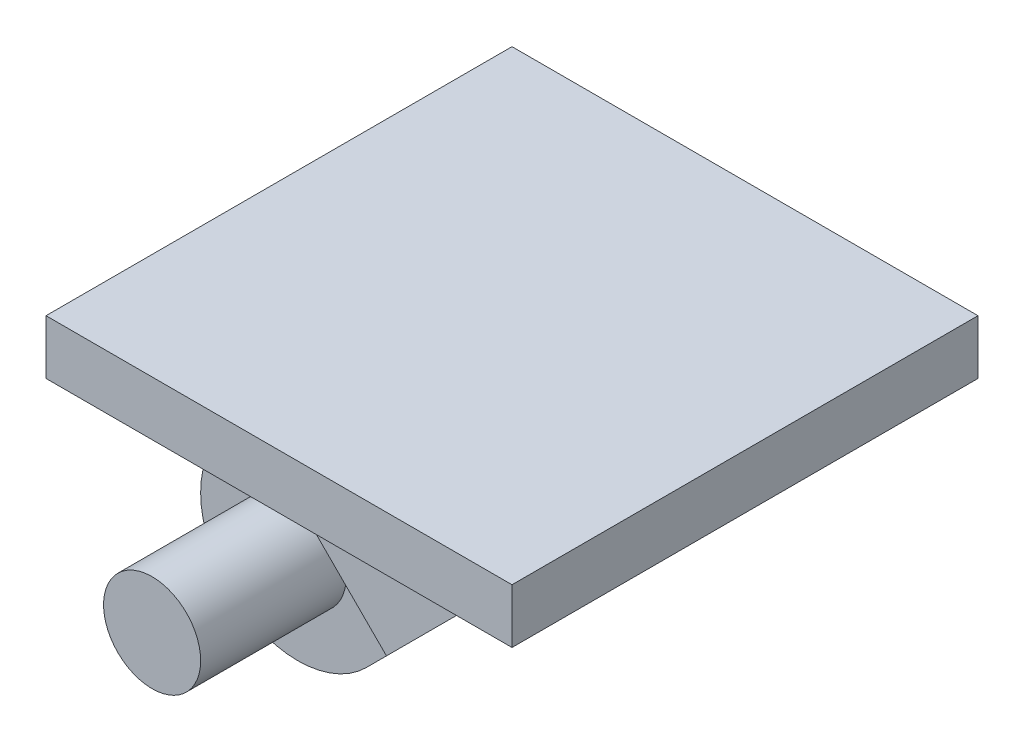
ISO-10303-21;
HEADER;
FILE_DESCRIPTION(('STEP AP214'),'2;1');
FILE_NAME('part.step','',(''),(''),'','','');
FILE_SCHEMA(('AUTOMOTIVE_DESIGN { 1 0 10303 214 1 1 1 1 }'));
ENDSEC;
DATA;
#1=APPLICATION_CONTEXT('core data for automotive mechanical design processes');
#2=APPLICATION_PROTOCOL_DEFINITION('international standard','automotive_design',2000,#1);
#3=PRODUCT_CONTEXT('',#1,'mechanical');
#4=PRODUCT('Part','Part','',(#3));
#5=PRODUCT_RELATED_PRODUCT_CATEGORY('part','',(#4));
#6=PRODUCT_DEFINITION_FORMATION('','',#4);
#7=PRODUCT_DEFINITION_CONTEXT('part definition',#1,'design');
#8=PRODUCT_DEFINITION('design','',#6,#7);
#9=PRODUCT_DEFINITION_SHAPE('','',#8);
#10=(LENGTH_UNIT() NAMED_UNIT(*) SI_UNIT(.MILLI.,.METRE.));
#11=(NAMED_UNIT(*) PLANE_ANGLE_UNIT() SI_UNIT($,.RADIAN.));
#12=(NAMED_UNIT(*) SI_UNIT($,.STERADIAN.) SOLID_ANGLE_UNIT());
#13=UNCERTAINTY_MEASURE_WITH_UNIT(LENGTH_MEASURE(1.E-05),#10,'distance_accuracy_value','');
#14=(GEOMETRIC_REPRESENTATION_CONTEXT(3) GLOBAL_UNCERTAINTY_ASSIGNED_CONTEXT((#13)) GLOBAL_UNIT_ASSIGNED_CONTEXT((#10,
#11,#12)) REPRESENTATION_CONTEXT('',''));
#15=CARTESIAN_POINT('',(0.,0.,0.));
#16=DIRECTION('',(0.,0.,1.));
#17=DIRECTION('',(1.,0.,0.));
#18=AXIS2_PLACEMENT_3D('',#15,#16,#17);
#19=CARTESIAN_POINT('',(-12.5,0.,-12.5));
#20=DIRECTION('',(-0.707106781186546,0.707106781186549,0.));
#21=DIRECTION('',(-0.707106781186549,-0.707106781186546,0.));
#22=AXIS2_PLACEMENT_3D('',#19,#20,#21);
#23=PLANE('',#22);
#24=DIRECTION('',(0.70710678118655,0.707106781186545,0.));
#25=VECTOR('',#24,1.);
#26=CARTESIAN_POINT('',(-30.1776695296637,-17.6776695296636,6.25));
#27=LINE('',#26,#25);
#28=CARTESIAN_POINT('',(-30.1776695296637,-17.6776695296637,6.25));
#29=VERTEX_POINT('',#28);
#30=CARTESIAN_POINT('',(-21.3388347648319,-8.8388347648319,6.25));
#31=VERTEX_POINT('',#30);
#32=EDGE_CURVE('E140',#29,#31,#27,.T.);
#33=ORIENTED_EDGE('',*,*,#32,.T.);
#34=DIRECTION('',(0.,0.,1.));
#35=VECTOR('',#34,1.);
#36=CARTESIAN_POINT('',(-21.3388347648319,-8.8388347648319,6.25));
#37=LINE('',#36,#35);
#38=CARTESIAN_POINT('',(-21.3388347648319,-8.8388347648319,12.5));
#39=VERTEX_POINT('',#38);
#40=EDGE_CURVE('E296',#31,#39,#37,.T.);
#41=ORIENTED_EDGE('',*,*,#40,.T.);
#42=DIRECTION('',(-0.707106781186549,-0.707106781186546,0.));
#43=VECTOR('',#42,1.);
#44=CARTESIAN_POINT('',(-12.5,0.,12.5));
#45=LINE('',#44,#43);
#46=CARTESIAN_POINT('',(-12.5,0.,12.5));
#47=VERTEX_POINT('',#46);
#48=EDGE_CURVE('E320',#47,#39,#45,.T.);
#49=ORIENTED_EDGE('',*,*,#48,.F.);
#50=DIRECTION('',(0.,0.,1.));
#51=VECTOR('',#50,1.);
#52=CARTESIAN_POINT('',(-12.5,0.,-12.5));
#53=LINE('',#52,#51);
#54=CARTESIAN_POINT('',(-12.5,0.,-12.5));
#55=VERTEX_POINT('',#54);
#56=EDGE_CURVE('E330',#55,#47,#53,.T.);
#57=ORIENTED_EDGE('',*,*,#56,.F.);
#58=DIRECTION('',(-0.707106781186549,-0.707106781186546,0.));
#59=VECTOR('',#58,1.);
#60=CARTESIAN_POINT('',(-12.5,0.,-12.5));
#61=LINE('',#60,#59);
#62=CARTESIAN_POINT('',(-21.3388347648319,-8.83883476483189,-12.5));
#63=VERTEX_POINT('',#62);
#64=EDGE_CURVE('E158',#55,#63,#61,.T.);
#65=ORIENTED_EDGE('',*,*,#64,.T.);
#66=DIRECTION('',(0.,0.,-1.));
#67=VECTOR('',#66,1.);
#68=CARTESIAN_POINT('',(-21.3388347648319,-8.8388347648319,-6.25));
#69=LINE('',#68,#67);
#70=CARTESIAN_POINT('',(-21.3388347648319,-8.8388347648319,-6.25));
#71=VERTEX_POINT('',#70);
#72=EDGE_CURVE('E61',#71,#63,#69,.T.);
#73=ORIENTED_EDGE('',*,*,#72,.F.);
#74=DIRECTION('',(-0.70710678118655,-0.707106781186545,0.));
#75=VECTOR('',#74,1.);
#76=CARTESIAN_POINT('',(-30.1776695296637,-17.6776695296636,-6.25));
#77=LINE('',#76,#75);
#78=CARTESIAN_POINT('',(-30.1776695296637,-17.6776695296637,-6.25));
#79=VERTEX_POINT('',#78);
#80=EDGE_CURVE('E302',#71,#79,#77,.T.);
#81=ORIENTED_EDGE('',*,*,#80,.T.);
#82=DIRECTION('',(0.,0.,1.));
#83=VECTOR('',#82,1.);
#84=CARTESIAN_POINT('',(-30.1776695296637,-17.6776695296637,-12.5));
#85=LINE('',#84,#83);
#86=EDGE_CURVE('E183',#79,#29,#85,.T.);
#87=ORIENTED_EDGE('',*,*,#86,.T.);
#88=EDGE_LOOP('',(#33,#41,#49,#57,#65,#73,#81,#87));
#89=FACE_BOUND('',#88,.T.);
#90=ADVANCED_FACE('F38',(#89),#23,.T.);
#91=CARTESIAN_POINT('',(-12.5000000000001,-35.3553390593274,-12.5));
#92=DIRECTION('',(0.707106781186547,-0.707106781186548,0.));
#93=DIRECTION('',(0.707106781186548,0.707106781186547,0.));
#94=AXIS2_PLACEMENT_3D('',#91,#92,#93);
#95=PLANE('',#94);
#96=DIRECTION('',(0.707106781186548,0.707106781186547,0.));
#97=VECTOR('',#96,1.);
#98=CARTESIAN_POINT('',(-12.5000000000001,-35.3553390593274,12.5));
#99=LINE('',#98,#97);
#100=CARTESIAN_POINT('',(-3.66116523516812,-26.5165042944955,12.5));
#101=VERTEX_POINT('',#100);
#102=CARTESIAN_POINT('',(5.17766952966365,-17.6776695296637,12.5));
#103=VERTEX_POINT('',#102);
#104=EDGE_CURVE('E313',#101,#103,#99,.T.);
#105=ORIENTED_EDGE('',*,*,#104,.F.);
#106=DIRECTION('',(0.,0.,1.));
#107=VECTOR('',#106,1.);
#108=CARTESIAN_POINT('',(-3.66116523516814,-26.5165042944955,6.25));
#109=LINE('',#108,#107);
#110=CARTESIAN_POINT('',(-3.66116523516814,-26.5165042944955,6.25));
#111=VERTEX_POINT('',#110);
#112=EDGE_CURVE('E53',#111,#101,#109,.T.);
#113=ORIENTED_EDGE('',*,*,#112,.F.);
#114=DIRECTION('',(-0.707106781186548,-0.707106781186548,0.));
#115=VECTOR('',#114,1.);
#116=CARTESIAN_POINT('',(-12.5,-35.3553390593274,6.25));
#117=LINE('',#116,#115);
#118=CARTESIAN_POINT('',(-12.5000000000001,-35.3553390593274,6.25));
#119=VERTEX_POINT('',#118);
#120=EDGE_CURVE('E138',#111,#119,#117,.T.);
#121=ORIENTED_EDGE('',*,*,#120,.T.);
#122=DIRECTION('',(0.,0.,1.));
#123=VECTOR('',#122,1.);
#124=CARTESIAN_POINT('',(-12.5000000000001,-35.3553390593274,-12.5));
#125=LINE('',#124,#123);
#126=CARTESIAN_POINT('',(-12.5000000000001,-35.3553390593274,-6.25));
#127=VERTEX_POINT('',#126);
#128=EDGE_CURVE('E151',#127,#119,#125,.T.);
#129=ORIENTED_EDGE('',*,*,#128,.F.);
#130=DIRECTION('',(0.707106781186548,0.707106781186548,0.));
#131=VECTOR('',#130,1.);
#132=CARTESIAN_POINT('',(-12.5,-35.3553390593274,-6.25));
#133=LINE('',#132,#131);
#134=CARTESIAN_POINT('',(-3.66116523516814,-26.5165042944955,-6.25));
#135=VERTEX_POINT('',#134);
#136=EDGE_CURVE('E306',#127,#135,#133,.T.);
#137=ORIENTED_EDGE('',*,*,#136,.T.);
#138=DIRECTION('',(0.,0.,-1.));
#139=VECTOR('',#138,1.);
#140=CARTESIAN_POINT('',(-3.66116523516814,-26.5165042944955,-6.25));
#141=LINE('',#140,#139);
#142=CARTESIAN_POINT('',(-3.66116523516814,-26.5165042944955,-12.5));
#143=VERTEX_POINT('',#142);
#144=EDGE_CURVE('E308',#135,#143,#141,.T.);
#145=ORIENTED_EDGE('',*,*,#144,.T.);
#146=DIRECTION('',(0.707106781186548,0.707106781186547,0.));
#147=VECTOR('',#146,1.);
#148=CARTESIAN_POINT('',(-12.5000000000001,-35.3553390593274,-12.5));
#149=LINE('',#148,#147);
#150=CARTESIAN_POINT('',(5.17766952966365,-17.6776695296637,-12.5));
#151=VERTEX_POINT('',#150);
#152=EDGE_CURVE('E322',#143,#151,#149,.T.);
#153=ORIENTED_EDGE('',*,*,#152,.T.);
#154=DIRECTION('',(0.,0.,1.));
#155=VECTOR('',#154,1.);
#156=CARTESIAN_POINT('',(5.17766952966365,-17.6776695296637,-12.5));
#157=LINE('',#156,#155);
#158=EDGE_CURVE('E157',#151,#103,#157,.T.);
#159=ORIENTED_EDGE('',*,*,#158,.T.);
#160=EDGE_LOOP('',(#105,#113,#121,#129,#137,#145,#153,#159));
#161=FACE_BOUND('',#160,.T.);
#162=ADVANCED_FACE('F149',(#161),#95,.T.);
#163=CARTESIAN_POINT('',(-21.3388347648319,-26.5165042944955,-12.5));
#164=DIRECTION('',(0.,0.,1.));
#165=DIRECTION('',(1.,0.,0.));
#166=AXIS2_PLACEMENT_3D('',#163,#164,#165);
#167=CYLINDRICAL_SURFACE('',#166,12.5);
#168=ORIENTED_EDGE('',*,*,#128,.T.);
#169=CARTESIAN_POINT('',(-21.3388347648319,-26.5165042944955,6.25));
#170=DIRECTION('',(0.,0.,1.));
#171=DIRECTION('',(1.,0.,0.));
#172=AXIS2_PLACEMENT_3D('',#169,#170,#171);
#173=CIRCLE('',#172,12.5);
#174=EDGE_CURVE('E134',#29,#119,#173,.T.);
#175=ORIENTED_EDGE('',*,*,#174,.F.);
#176=ORIENTED_EDGE('',*,*,#86,.F.);
#177=CARTESIAN_POINT('',(-21.3388347648319,-26.5165042944955,-6.25));
#178=DIRECTION('',(0.,0.,1.));
#179=DIRECTION('',(1.,0.,0.));
#180=AXIS2_PLACEMENT_3D('',#177,#178,#179);
#181=CIRCLE('',#180,12.5);
#182=EDGE_CURVE('E156',#79,#127,#181,.T.);
#183=ORIENTED_EDGE('',*,*,#182,.T.);
#184=EDGE_LOOP('',(#168,#175,#176,#183));
#185=FACE_BOUND('',#184,.T.);
#186=ADVANCED_FACE('F155',(#185),#167,.T.);
#187=CARTESIAN_POINT('',(-21.3388347648319,-26.5165042944955,12.5));
#188=DIRECTION('',(0.,0.,1.));
#189=DIRECTION('',(1.,0.,0.));
#190=AXIS2_PLACEMENT_3D('',#187,#188,#189);
#191=PLANE('',#190);
#192=ORIENTED_EDGE('',*,*,#48,.T.);
#193=DIRECTION('',(0.707106781186551,-0.707106781186544,0.));
#194=VECTOR('',#193,1.);
#195=CARTESIAN_POINT('',(-12.5000000000001,-17.6776695296636,12.5));
#196=LINE('',#195,#194);
#197=EDGE_CURVE('E152',#39,#101,#196,.T.);
#198=ORIENTED_EDGE('',*,*,#197,.T.);
#199=ORIENTED_EDGE('',*,*,#104,.T.);
#200=CARTESIAN_POINT('',(-12.5,0.,12.5));
#201=DIRECTION('',(0.,0.,1.));
#202=DIRECTION('',(1.,0.,0.));
#203=AXIS2_PLACEMENT_3D('',#200,#201,#202);
#204=CIRCLE('',#203,25.);
#205=CARTESIAN_POINT('',(12.5,0.,12.5));
#206=VERTEX_POINT('',#205);
#207=EDGE_CURVE('E315',#103,#206,#204,.T.);
#208=ORIENTED_EDGE('',*,*,#207,.T.);
#209=DIRECTION('',(-1.,0.,0.));
#210=VECTOR('',#209,1.);
#211=CARTESIAN_POINT('',(-12.5,0.,12.5));
#212=LINE('',#211,#210);
#213=EDGE_CURVE('E318',#206,#47,#212,.T.);
#214=ORIENTED_EDGE('',*,*,#213,.T.);
#215=EDGE_LOOP('',(#192,#198,#199,#208,#214));
#216=FACE_BOUND('',#215,.T.);
#217=ADVANCED_FACE('F242',(#216),#191,.T.);
#218=CARTESIAN_POINT('',(-21.3388347648319,-26.5165042944955,-12.5));
#219=DIRECTION('',(0.,0.,1.));
#220=DIRECTION('',(1.,0.,0.));
#221=AXIS2_PLACEMENT_3D('',#218,#219,#220);
#222=PLANE('',#221);
#223=DIRECTION('',(-0.707106781186551,0.707106781186544,0.));
#224=VECTOR('',#223,1.);
#225=CARTESIAN_POINT('',(-12.5000000000001,-17.6776695296636,-12.5));
#226=LINE('',#225,#224);
#227=EDGE_CURVE('E299',#143,#63,#226,.T.);
#228=ORIENTED_EDGE('',*,*,#227,.T.);
#229=ORIENTED_EDGE('',*,*,#64,.F.);
#230=DIRECTION('',(-1.,0.,0.));
#231=VECTOR('',#230,1.);
#232=CARTESIAN_POINT('',(-12.5,0.,-12.5));
#233=LINE('',#232,#231);
#234=CARTESIAN_POINT('',(12.5,0.,-12.5));
#235=VERTEX_POINT('',#234);
#236=EDGE_CURVE('E164',#235,#55,#233,.T.);
#237=ORIENTED_EDGE('',*,*,#236,.F.);
#238=CARTESIAN_POINT('',(-12.5,0.,-12.5));
#239=DIRECTION('',(0.,0.,1.));
#240=DIRECTION('',(1.,0.,0.));
#241=AXIS2_PLACEMENT_3D('',#238,#239,#240);
#242=CIRCLE('',#241,25.);
#243=EDGE_CURVE('E324',#151,#235,#242,.T.);
#244=ORIENTED_EDGE('',*,*,#243,.F.);
#245=ORIENTED_EDGE('',*,*,#152,.F.);
#246=EDGE_LOOP('',(#228,#229,#237,#244,#245));
#247=FACE_BOUND('',#246,.T.);
#248=ADVANCED_FACE('F239',(#247),#222,.F.);
#249=CARTESIAN_POINT('',(0.,0.,0.));
#250=DIRECTION('',(0.,-1.,0.));
#251=DIRECTION('',(0.,0.,-1.));
#252=AXIS2_PLACEMENT_3D('',#249,#250,#251);
#253=PLANE('',#252);
#254=DIRECTION('',(0.,0.,-1.));
#255=VECTOR('',#254,1.);
#256=CARTESIAN_POINT('',(30.,0.,30.));
#257=LINE('',#256,#255);
#258=CARTESIAN_POINT('',(30.,0.,30.));
#259=VERTEX_POINT('',#258);
#260=CARTESIAN_POINT('',(30.,0.,-30.));
#261=VERTEX_POINT('',#260);
#262=EDGE_CURVE('E179',#259,#261,#257,.T.);
#263=ORIENTED_EDGE('',*,*,#262,.F.);
#264=DIRECTION('',(1.,0.,0.));
#265=VECTOR('',#264,1.);
#266=CARTESIAN_POINT('',(-30.,0.,30.));
#267=LINE('',#266,#265);
#268=CARTESIAN_POINT('',(-30.,0.,30.));
#269=VERTEX_POINT('',#268);
#270=EDGE_CURVE('E172',#269,#259,#267,.T.);
#271=ORIENTED_EDGE('',*,*,#270,.F.);
#272=DIRECTION('',(0.,0.,1.));
#273=VECTOR('',#272,1.);
#274=CARTESIAN_POINT('',(-30.,0.,30.));
#275=LINE('',#274,#273);
#276=CARTESIAN_POINT('',(-30.,0.,-30.));
#277=VERTEX_POINT('',#276);
#278=EDGE_CURVE('E185',#277,#269,#275,.T.);
#279=ORIENTED_EDGE('',*,*,#278,.F.);
#280=DIRECTION('',(-1.,0.,0.));
#281=VECTOR('',#280,1.);
#282=CARTESIAN_POINT('',(-30.,0.,-30.));
#283=LINE('',#282,#281);
#284=EDGE_CURVE('E182',#261,#277,#283,.T.);
#285=ORIENTED_EDGE('',*,*,#284,.F.);
#286=EDGE_LOOP('',(#263,#271,#279,#285));
#287=FACE_BOUND('',#286,.T.);
#288=ORIENTED_EDGE('',*,*,#236,.T.);
#289=ORIENTED_EDGE('',*,*,#56,.T.);
#290=ORIENTED_EDGE('',*,*,#213,.F.);
#291=DIRECTION('',(0.,0.,1.));
#292=VECTOR('',#291,1.);
#293=CARTESIAN_POINT('',(12.5,0.,-12.5));
#294=LINE('',#293,#292);
#295=EDGE_CURVE('E161',#235,#206,#294,.T.);
#296=ORIENTED_EDGE('',*,*,#295,.F.);
#297=EDGE_LOOP('',(#288,#289,#290,#296));
#298=FACE_BOUND('',#297,.T.);
#299=ADVANCED_FACE('F206',(#287,#298),#253,.T.);
#300=CARTESIAN_POINT('',(30.,7.,30.));
#301=DIRECTION('',(-1.,0.,0.));
#302=DIRECTION('',(0.,0.,1.));
#303=AXIS2_PLACEMENT_3D('',#300,#301,#302);
#304=PLANE('',#303);
#305=ORIENTED_EDGE('',*,*,#262,.T.);
#306=DIRECTION('',(0.,-1.,0.));
#307=VECTOR('',#306,1.);
#308=CARTESIAN_POINT('',(30.,7.,-30.));
#309=LINE('',#308,#307);
#310=CARTESIAN_POINT('',(30.,7.,-30.));
#311=VERTEX_POINT('',#310);
#312=EDGE_CURVE('E46',#311,#261,#309,.T.);
#313=ORIENTED_EDGE('',*,*,#312,.F.);
#314=DIRECTION('',(0.,0.,-1.));
#315=VECTOR('',#314,1.);
#316=CARTESIAN_POINT('',(30.,7.,30.));
#317=LINE('',#316,#315);
#318=CARTESIAN_POINT('',(30.,7.,30.));
#319=VERTEX_POINT('',#318);
#320=EDGE_CURVE('E168',#319,#311,#317,.T.);
#321=ORIENTED_EDGE('',*,*,#320,.F.);
#322=DIRECTION('',(0.,-1.,0.));
#323=VECTOR('',#322,1.);
#324=CARTESIAN_POINT('',(30.,7.,30.));
#325=LINE('',#324,#323);
#326=EDGE_CURVE('E178',#319,#259,#325,.T.);
#327=ORIENTED_EDGE('',*,*,#326,.T.);
#328=EDGE_LOOP('',(#305,#313,#321,#327));
#329=FACE_BOUND('',#328,.T.);
#330=ADVANCED_FACE('F40',(#329),#304,.F.);
#331=CARTESIAN_POINT('',(-30.,7.,-30.));
#332=DIRECTION('',(0.,0.,1.));
#333=DIRECTION('',(1.,0.,0.));
#334=AXIS2_PLACEMENT_3D('',#331,#332,#333);
#335=PLANE('',#334);
#336=ORIENTED_EDGE('',*,*,#284,.T.);
#337=DIRECTION('',(0.,-1.,0.));
#338=VECTOR('',#337,1.);
#339=CARTESIAN_POINT('',(-30.,7.,-30.));
#340=LINE('',#339,#338);
#341=CARTESIAN_POINT('',(-30.,7.,-30.));
#342=VERTEX_POINT('',#341);
#343=EDGE_CURVE('E193',#342,#277,#340,.T.);
#344=ORIENTED_EDGE('',*,*,#343,.F.);
#345=DIRECTION('',(-1.,0.,0.));
#346=VECTOR('',#345,1.);
#347=CARTESIAN_POINT('',(-30.,7.,-30.));
#348=LINE('',#347,#346);
#349=EDGE_CURVE('E171',#311,#342,#348,.T.);
#350=ORIENTED_EDGE('',*,*,#349,.F.);
#351=ORIENTED_EDGE('',*,*,#312,.T.);
#352=EDGE_LOOP('',(#336,#344,#350,#351));
#353=FACE_BOUND('',#352,.T.);
#354=ADVANCED_FACE('F198',(#353),#335,.F.);
#355=CARTESIAN_POINT('',(-30.,7.,30.));
#356=DIRECTION('',(1.,0.,0.));
#357=DIRECTION('',(0.,0.,-1.));
#358=AXIS2_PLACEMENT_3D('',#355,#356,#357);
#359=PLANE('',#358);
#360=ORIENTED_EDGE('',*,*,#278,.T.);
#361=DIRECTION('',(0.,-1.,0.));
#362=VECTOR('',#361,1.);
#363=CARTESIAN_POINT('',(-30.,7.,30.));
#364=LINE('',#363,#362);
#365=CARTESIAN_POINT('',(-30.,7.,30.));
#366=VERTEX_POINT('',#365);
#367=EDGE_CURVE('E190',#366,#269,#364,.T.);
#368=ORIENTED_EDGE('',*,*,#367,.F.);
#369=DIRECTION('',(0.,0.,1.));
#370=VECTOR('',#369,1.);
#371=CARTESIAN_POINT('',(-30.,7.,30.));
#372=LINE('',#371,#370);
#373=EDGE_CURVE('E174',#342,#366,#372,.T.);
#374=ORIENTED_EDGE('',*,*,#373,.F.);
#375=ORIENTED_EDGE('',*,*,#343,.T.);
#376=EDGE_LOOP('',(#360,#368,#374,#375));
#377=FACE_BOUND('',#376,.T.);
#378=ADVANCED_FACE('F211',(#377),#359,.F.);
#379=CARTESIAN_POINT('',(-30.,7.,30.));
#380=DIRECTION('',(0.,0.,-1.));
#381=DIRECTION('',(-1.,0.,0.));
#382=AXIS2_PLACEMENT_3D('',#379,#380,#381);
#383=PLANE('',#382);
#384=ORIENTED_EDGE('',*,*,#270,.T.);
#385=ORIENTED_EDGE('',*,*,#326,.F.);
#386=DIRECTION('',(1.,0.,0.));
#387=VECTOR('',#386,1.);
#388=CARTESIAN_POINT('',(-30.,7.,30.));
#389=LINE('',#388,#387);
#390=EDGE_CURVE('E176',#366,#319,#389,.T.);
#391=ORIENTED_EDGE('',*,*,#390,.F.);
#392=ORIENTED_EDGE('',*,*,#367,.T.);
#393=EDGE_LOOP('',(#384,#385,#391,#392));
#394=FACE_BOUND('',#393,.T.);
#395=ADVANCED_FACE('F215',(#394),#383,.F.);
#396=CARTESIAN_POINT('',(0.,7.,0.));
#397=DIRECTION('',(0.,-1.,0.));
#398=DIRECTION('',(0.,0.,-1.));
#399=AXIS2_PLACEMENT_3D('',#396,#397,#398);
#400=PLANE('',#399);
#401=ORIENTED_EDGE('',*,*,#320,.T.);
#402=ORIENTED_EDGE('',*,*,#349,.T.);
#403=ORIENTED_EDGE('',*,*,#373,.T.);
#404=ORIENTED_EDGE('',*,*,#390,.T.);
#405=EDGE_LOOP('',(#401,#402,#403,#404));
#406=FACE_BOUND('',#405,.T.);
#407=ADVANCED_FACE('F217',(#406),#400,.F.);
#408=CARTESIAN_POINT('',(-12.5,0.,-12.5));
#409=DIRECTION('',(0.,0.,1.));
#410=DIRECTION('',(1.,0.,0.));
#411=AXIS2_PLACEMENT_3D('',#408,#409,#410);
#412=CYLINDRICAL_SURFACE('',#411,25.);
#413=ORIENTED_EDGE('',*,*,#295,.T.);
#414=ORIENTED_EDGE('',*,*,#207,.F.);
#415=ORIENTED_EDGE('',*,*,#158,.F.);
#416=ORIENTED_EDGE('',*,*,#243,.T.);
#417=EDGE_LOOP('',(#413,#414,#415,#416));
#418=FACE_BOUND('',#417,.T.);
#419=ADVANCED_FACE('F219',(#418),#412,.T.);
#420=CARTESIAN_POINT('',(-12.5000000000001,-17.6776695296636,-6.25));
#421=DIRECTION('',(-0.707106781186544,-0.707106781186551,0.));
#422=DIRECTION('',(0.707106781186551,-0.707106781186544,0.));
#423=AXIS2_PLACEMENT_3D('',#420,#421,#422);
#424=PLANE('',#423);
#425=ORIENTED_EDGE('',*,*,#227,.F.);
#426=ORIENTED_EDGE('',*,*,#144,.F.);
#427=DIRECTION('',(-0.707106781186551,0.707106781186544,0.));
#428=VECTOR('',#427,1.);
#429=CARTESIAN_POINT('',(-12.5000000000001,-17.6776695296636,-6.25));
#430=LINE('',#429,#428);
#431=EDGE_CURVE('E300',#135,#71,#430,.T.);
#432=ORIENTED_EDGE('',*,*,#431,.T.);
#433=ORIENTED_EDGE('',*,*,#72,.T.);
#434=EDGE_LOOP('',(#425,#426,#432,#433));
#435=FACE_BOUND('',#434,.T.);
#436=ADVANCED_FACE('F225',(#435),#424,.T.);
#437=CARTESIAN_POINT('',(-21.3388347648319,-26.5165042944955,-6.25));
#438=DIRECTION('',(0.,0.,1.));
#439=DIRECTION('',(1.,0.,0.));
#440=AXIS2_PLACEMENT_3D('',#437,#438,#439);
#441=PLANE('',#440);
#442=CARTESIAN_POINT('',(-21.3388347648319,-26.5165042944955,-6.25));
#443=DIRECTION('',(0.,0.,1.));
#444=DIRECTION('',(1.,0.,0.));
#445=AXIS2_PLACEMENT_3D('',#442,#443,#444);
#446=CIRCLE('',#445,6.25);
#447=CARTESIAN_POINT('',(-15.0888347648319,-26.5165042944955,-6.25));
#448=VERTEX_POINT('',#447);
#449=EDGE_CURVE('E286',#448,#448,#446,.T.);
#450=ORIENTED_EDGE('',*,*,#449,.T.);
#451=EDGE_LOOP('',(#450));
#452=FACE_BOUND('',#451,.T.);
#453=ORIENTED_EDGE('',*,*,#431,.F.);
#454=ORIENTED_EDGE('',*,*,#136,.F.);
#455=ORIENTED_EDGE('',*,*,#182,.F.);
#456=ORIENTED_EDGE('',*,*,#80,.F.);
#457=EDGE_LOOP('',(#453,#454,#455,#456));
#458=FACE_BOUND('',#457,.T.);
#459=ADVANCED_FACE('F255',(#452,#458),#441,.F.);
#460=CARTESIAN_POINT('',(-12.5000000000001,-17.6776695296636,6.25));
#461=DIRECTION('',(-0.707106781186544,-0.707106781186551,0.));
#462=DIRECTION('',(0.707106781186551,-0.707106781186544,0.));
#463=AXIS2_PLACEMENT_3D('',#460,#461,#462);
#464=PLANE('',#463);
#465=ORIENTED_EDGE('',*,*,#197,.F.);
#466=ORIENTED_EDGE('',*,*,#40,.F.);
#467=DIRECTION('',(0.707106781186551,-0.707106781186544,0.));
#468=VECTOR('',#467,1.);
#469=CARTESIAN_POINT('',(-12.5000000000001,-17.6776695296636,6.25));
#470=LINE('',#469,#468);
#471=EDGE_CURVE('E292',#31,#111,#470,.T.);
#472=ORIENTED_EDGE('',*,*,#471,.T.);
#473=ORIENTED_EDGE('',*,*,#112,.T.);
#474=EDGE_LOOP('',(#465,#466,#472,#473));
#475=FACE_BOUND('',#474,.T.);
#476=ADVANCED_FACE('F258',(#475),#464,.T.);
#477=CARTESIAN_POINT('',(-21.3388347648319,-26.5165042944955,6.25));
#478=DIRECTION('',(0.,0.,1.));
#479=DIRECTION('',(1.,0.,0.));
#480=AXIS2_PLACEMENT_3D('',#477,#478,#479);
#481=PLANE('',#480);
#482=CARTESIAN_POINT('',(-21.3388347648319,-26.5165042944955,6.25));
#483=DIRECTION('',(0.,0.,1.));
#484=DIRECTION('',(1.,0.,0.));
#485=AXIS2_PLACEMENT_3D('',#482,#483,#484);
#486=CIRCLE('',#485,6.25);
#487=CARTESIAN_POINT('',(-15.0888347648319,-26.5165042944955,6.25));
#488=VERTEX_POINT('',#487);
#489=EDGE_CURVE('E11',#488,#488,#486,.T.);
#490=ORIENTED_EDGE('',*,*,#489,.F.);
#491=EDGE_LOOP('',(#490));
#492=FACE_BOUND('',#491,.T.);
#493=ORIENTED_EDGE('',*,*,#120,.F.);
#494=ORIENTED_EDGE('',*,*,#471,.F.);
#495=ORIENTED_EDGE('',*,*,#32,.F.);
#496=ORIENTED_EDGE('',*,*,#174,.T.);
#497=EDGE_LOOP('',(#493,#494,#495,#496));
#498=FACE_BOUND('',#497,.T.);
#499=ADVANCED_FACE('F136',(#492,#498),#481,.T.);
#500=CARTESIAN_POINT('',(-21.3388347648319,-26.5165042944955,25.));
#501=DIRECTION('',(0.,0.,1.));
#502=DIRECTION('',(1.,0.,0.));
#503=AXIS2_PLACEMENT_3D('',#500,#501,#502);
#504=PLANE('',#503);
#505=CARTESIAN_POINT('',(-21.3388347648319,-26.5165042944955,25.));
#506=DIRECTION('',(0.,0.,1.));
#507=DIRECTION('',(1.,0.,0.));
#508=AXIS2_PLACEMENT_3D('',#505,#506,#507);
#509=CIRCLE('',#508,6.25);
#510=CARTESIAN_POINT('',(-15.0888347648319,-26.5165042944955,25.));
#511=VERTEX_POINT('',#510);
#512=EDGE_CURVE('E281',#511,#511,#509,.T.);
#513=ORIENTED_EDGE('',*,*,#512,.T.);
#514=EDGE_LOOP('',(#513));
#515=FACE_BOUND('',#514,.T.);
#516=ADVANCED_FACE('F264',(#515),#504,.T.);
#517=CARTESIAN_POINT('',(-21.3388347648319,-26.5165042944955,-25.));
#518=DIRECTION('',(0.,0.,1.));
#519=DIRECTION('',(1.,0.,0.));
#520=AXIS2_PLACEMENT_3D('',#517,#518,#519);
#521=CYLINDRICAL_SURFACE('',#520,6.25);
#522=ORIENTED_EDGE('',*,*,#489,.T.);
#523=EDGE_LOOP('',(#522));
#524=FACE_BOUND('',#523,.T.);
#525=ORIENTED_EDGE('',*,*,#512,.F.);
#526=EDGE_LOOP('',(#525));
#527=FACE_BOUND('',#526,.T.);
#528=ADVANCED_FACE('F266',(#524,#527),#521,.T.);
#529=CARTESIAN_POINT('',(-21.3388347648319,-26.5165042944955,-25.));
#530=DIRECTION('',(0.,0.,1.));
#531=DIRECTION('',(1.,0.,0.));
#532=AXIS2_PLACEMENT_3D('',#529,#530,#531);
#533=CIRCLE('',#532,6.25);
#534=CARTESIAN_POINT('',(-15.0888347648319,-26.5165042944955,-25.));
#535=VERTEX_POINT('',#534);
#536=EDGE_CURVE('E283',#535,#535,#533,.T.);
#537=ORIENTED_EDGE('',*,*,#536,.T.);
#538=EDGE_LOOP('',(#537));
#539=FACE_BOUND('',#538,.T.);
#540=ORIENTED_EDGE('',*,*,#449,.F.);
#541=EDGE_LOOP('',(#540));
#542=FACE_BOUND('',#541,.T.);
#543=ADVANCED_FACE('F269',(#539,#542),#521,.T.);
#544=CARTESIAN_POINT('',(-21.3388347648319,-26.5165042944955,-25.));
#545=DIRECTION('',(0.,0.,1.));
#546=DIRECTION('',(1.,0.,0.));
#547=AXIS2_PLACEMENT_3D('',#544,#545,#546);
#548=PLANE('',#547);
#549=ORIENTED_EDGE('',*,*,#536,.F.);
#550=EDGE_LOOP('',(#549));
#551=FACE_BOUND('',#550,.T.);
#552=ADVANCED_FACE('F271',(#551),#548,.F.);
#553=CLOSED_SHELL('',(#90,#162,#186,#217,#248,#299,#330,#354,#378,#395,#407,#419,#436,#459,#476,
#499,#516,#528,#543,#552));
#554=MANIFOLD_SOLID_BREP('B2',#553);
#555=ADVANCED_BREP_SHAPE_REPRESENTATION('',(#18,#554),#14);
#556=SHAPE_DEFINITION_REPRESENTATION(#9,#555);
ENDSEC;
END-ISO-10303-21;
